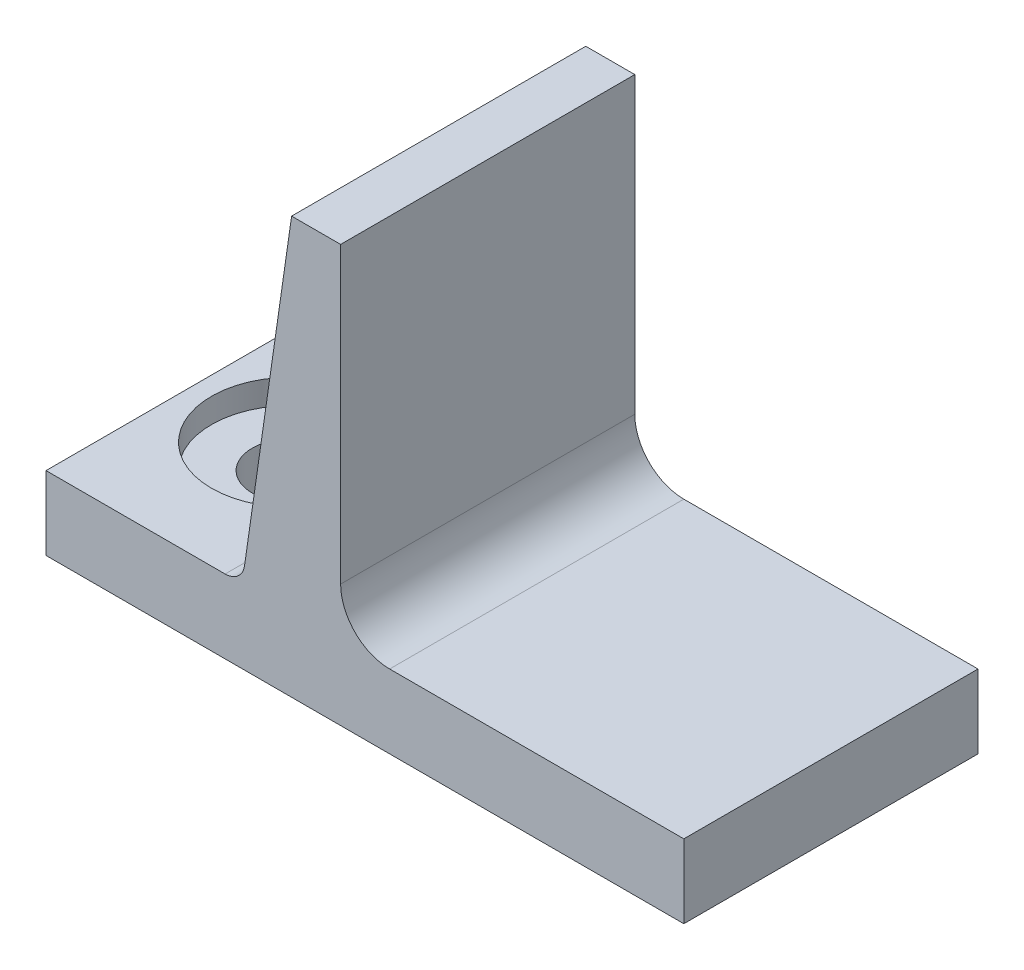
ISO-10303-21;
HEADER;
FILE_DESCRIPTION(('STEP AP214'),'2;1');
FILE_NAME('part.step','',(''),(''),'','','');
FILE_SCHEMA(('AUTOMOTIVE_DESIGN { 1 0 10303 214 1 1 1 1 }'));
ENDSEC;
DATA;
#1=APPLICATION_CONTEXT('core data for automotive mechanical design processes');
#2=APPLICATION_PROTOCOL_DEFINITION('international standard','automotive_design',2000,#1);
#3=PRODUCT_CONTEXT('',#1,'mechanical');
#4=PRODUCT('Part','Part','',(#3));
#5=PRODUCT_RELATED_PRODUCT_CATEGORY('part','',(#4));
#6=PRODUCT_DEFINITION_FORMATION('','',#4);
#7=PRODUCT_DEFINITION_CONTEXT('part definition',#1,'design');
#8=PRODUCT_DEFINITION('design','',#6,#7);
#9=PRODUCT_DEFINITION_SHAPE('','',#8);
#10=(LENGTH_UNIT() NAMED_UNIT(*) SI_UNIT(.MILLI.,.METRE.));
#11=(NAMED_UNIT(*) PLANE_ANGLE_UNIT() SI_UNIT($,.RADIAN.));
#12=(NAMED_UNIT(*) SI_UNIT($,.STERADIAN.) SOLID_ANGLE_UNIT());
#13=UNCERTAINTY_MEASURE_WITH_UNIT(LENGTH_MEASURE(1.E-05),#10,'distance_accuracy_value','');
#14=(GEOMETRIC_REPRESENTATION_CONTEXT(3) GLOBAL_UNCERTAINTY_ASSIGNED_CONTEXT((#13)) GLOBAL_UNIT_ASSIGNED_CONTEXT((#10,
#11,#12)) REPRESENTATION_CONTEXT('',''));
#15=CARTESIAN_POINT('',(0.,0.,0.));
#16=DIRECTION('',(0.,0.,1.));
#17=DIRECTION('',(1.,0.,0.));
#18=AXIS2_PLACEMENT_3D('',#15,#16,#17);
#19=CARTESIAN_POINT('',(0.,44.45,38.1));
#20=DIRECTION('',(-1.,0.,0.));
#21=DIRECTION('',(0.,-1.,0.));
#22=AXIS2_PLACEMENT_3D('',#19,#20,#21);
#23=PLANE('',#22);
#24=DIRECTION('',(0.,1.,0.));
#25=VECTOR('',#24,1.);
#26=CARTESIAN_POINT('',(0.,44.45,38.1));
#27=LINE('',#26,#25);
#28=CARTESIAN_POINT('',(0.,6.35000000000001,38.1));
#29=VERTEX_POINT('',#28);
#30=CARTESIAN_POINT('',(0.,44.45,38.1));
#31=VERTEX_POINT('',#30);
#32=EDGE_CURVE('E132',#29,#31,#27,.T.);
#33=ORIENTED_EDGE('',*,*,#32,.F.);
#34=DIRECTION('',(0.,0.,-1.));
#35=VECTOR('',#34,1.);
#36=CARTESIAN_POINT('',(0.,6.35000000000001,0.));
#37=LINE('',#36,#35);
#38=CARTESIAN_POINT('',(0.,6.35000000000001,0.));
#39=VERTEX_POINT('',#38);
#40=EDGE_CURVE('E171',#29,#39,#37,.T.);
#41=ORIENTED_EDGE('',*,*,#40,.T.);
#42=DIRECTION('',(0.,1.,0.));
#43=VECTOR('',#42,1.);
#44=CARTESIAN_POINT('',(0.,44.45,0.));
#45=LINE('',#44,#43);
#46=CARTESIAN_POINT('',(0.,44.45,0.));
#47=VERTEX_POINT('',#46);
#48=EDGE_CURVE('E155',#39,#47,#45,.T.);
#49=ORIENTED_EDGE('',*,*,#48,.T.);
#50=DIRECTION('',(0.,0.,-1.));
#51=VECTOR('',#50,1.);
#52=CARTESIAN_POINT('',(0.,44.45,38.1));
#53=LINE('',#52,#51);
#54=EDGE_CURVE('E149',#31,#47,#53,.T.);
#55=ORIENTED_EDGE('',*,*,#54,.F.);
#56=EDGE_LOOP('',(#33,#41,#49,#55));
#57=FACE_BOUND('',#56,.T.);
#58=ADVANCED_FACE('F56',(#57),#23,.F.);
#59=CARTESIAN_POINT('',(-6.35,44.45,38.1));
#60=DIRECTION('',(0.,-1.,0.));
#61=DIRECTION('',(0.,0.,-1.));
#62=AXIS2_PLACEMENT_3D('',#59,#60,#61);
#63=PLANE('',#62);
#64=DIRECTION('',(-1.,0.,0.));
#65=VECTOR('',#64,1.);
#66=CARTESIAN_POINT('',(-6.35,44.45,0.));
#67=LINE('',#66,#65);
#68=CARTESIAN_POINT('',(-6.35,44.45,0.));
#69=VERTEX_POINT('',#68);
#70=EDGE_CURVE('E215',#47,#69,#67,.T.);
#71=ORIENTED_EDGE('',*,*,#70,.T.);
#72=DIRECTION('',(0.,0.,-1.));
#73=VECTOR('',#72,1.);
#74=CARTESIAN_POINT('',(-6.35,44.45,38.1));
#75=LINE('',#74,#73);
#76=CARTESIAN_POINT('',(-6.35,44.45,38.1));
#77=VERTEX_POINT('',#76);
#78=EDGE_CURVE('E151',#77,#69,#75,.T.);
#79=ORIENTED_EDGE('',*,*,#78,.F.);
#80=DIRECTION('',(-1.,0.,0.));
#81=VECTOR('',#80,1.);
#82=CARTESIAN_POINT('',(-6.35,44.45,38.1));
#83=LINE('',#82,#81);
#84=EDGE_CURVE('E136',#31,#77,#83,.T.);
#85=ORIENTED_EDGE('',*,*,#84,.F.);
#86=ORIENTED_EDGE('',*,*,#54,.T.);
#87=EDGE_LOOP('',(#71,#79,#85,#86));
#88=FACE_BOUND('',#87,.T.);
#89=ADVANCED_FACE('F148',(#88),#63,.F.);
#90=CARTESIAN_POINT('',(-12.7608076,0.,38.1));
#91=DIRECTION('',(0.989759045724753,-0.142748139763802,0.));
#92=DIRECTION('',(0.142748139763802,0.989759045724753,0.));
#93=AXIS2_PLACEMENT_3D('',#90,#91,#92);
#94=PLANE('',#93);
#95=DIRECTION('',(-0.142748139763802,-0.989759045724753,0.));
#96=VECTOR('',#95,1.);
#97=CARTESIAN_POINT('',(-12.7608076,0.,0.));
#98=LINE('',#97,#96);
#99=CARTESIAN_POINT('',(-12.4467689291019,2.17741972499994,0.));
#100=VERTEX_POINT('',#99);
#101=EDGE_CURVE('E217',#69,#100,#98,.T.);
#102=ORIENTED_EDGE('',*,*,#101,.T.);
#103=DIRECTION('',(0.,0.,-1.));
#104=VECTOR('',#103,1.);
#105=CARTESIAN_POINT('',(-12.4467689291019,2.17741972499994,38.1));
#106=LINE('',#105,#104);
#107=CARTESIAN_POINT('',(-12.4467689291019,2.17741972499994,38.1));
#108=VERTEX_POINT('',#107);
#109=EDGE_CURVE('E160',#100,#108,#106,.F.);
#110=ORIENTED_EDGE('',*,*,#109,.T.);
#111=DIRECTION('',(-0.142748139763802,-0.989759045724753,0.));
#112=VECTOR('',#111,1.);
#113=CARTESIAN_POINT('',(-12.7608076,0.,38.1));
#114=LINE('',#113,#112);
#115=EDGE_CURVE('E153',#77,#108,#114,.T.);
#116=ORIENTED_EDGE('',*,*,#115,.F.);
#117=ORIENTED_EDGE('',*,*,#78,.T.);
#118=EDGE_LOOP('',(#102,#110,#116,#117));
#119=FACE_BOUND('',#118,.T.);
#120=ADVANCED_FACE('F264',(#119),#94,.F.);
#121=CARTESIAN_POINT('',(-38.1608076,0.,38.1));
#122=DIRECTION('',(0.,-1.,0.));
#123=DIRECTION('',(0.,0.,-1.));
#124=AXIS2_PLACEMENT_3D('',#121,#122,#123);
#125=PLANE('',#124);
#126=CARTESIAN_POINT('',(-25.4608076,0.,19.05));
#127=DIRECTION('',(0.,1.,0.));
#128=DIRECTION('',(0.,0.,1.));
#129=AXIS2_PLACEMENT_3D('',#126,#127,#128);
#130=CIRCLE('',#129,10.31875);
#131=CARTESIAN_POINT('',(-25.4608076,0.,29.36875));
#132=VERTEX_POINT('',#131);
#133=EDGE_CURVE('E177',#132,#132,#130,.T.);
#134=ORIENTED_EDGE('',*,*,#133,.F.);
#135=EDGE_LOOP('',(#134));
#136=FACE_BOUND('',#135,.T.);
#137=DIRECTION('',(-1.,0.,0.));
#138=VECTOR('',#137,1.);
#139=CARTESIAN_POINT('',(-38.1608076,0.,38.1));
#140=LINE('',#139,#138);
#141=CARTESIAN_POINT('',(-14.9607569052428,0.,38.1));
#142=VERTEX_POINT('',#141);
#143=CARTESIAN_POINT('',(-38.1608076,0.,38.1));
#144=VERTEX_POINT('',#143);
#145=EDGE_CURVE('E193',#142,#144,#140,.T.);
#146=ORIENTED_EDGE('',*,*,#145,.F.);
#147=DIRECTION('',(0.,0.,-1.));
#148=VECTOR('',#147,1.);
#149=CARTESIAN_POINT('',(-14.9607569052428,0.,0.));
#150=LINE('',#149,#148);
#151=CARTESIAN_POINT('',(-14.9607569052428,0.,0.));
#152=VERTEX_POINT('',#151);
#153=EDGE_CURVE('E157',#142,#152,#150,.T.);
#154=ORIENTED_EDGE('',*,*,#153,.T.);
#155=DIRECTION('',(-1.,0.,0.));
#156=VECTOR('',#155,1.);
#157=CARTESIAN_POINT('',(-38.1608076,0.,0.));
#158=LINE('',#157,#156);
#159=CARTESIAN_POINT('',(-38.1608076,0.,0.));
#160=VERTEX_POINT('',#159);
#161=EDGE_CURVE('E225',#152,#160,#158,.T.);
#162=ORIENTED_EDGE('',*,*,#161,.T.);
#163=DIRECTION('',(0.,0.,-1.));
#164=VECTOR('',#163,1.);
#165=CARTESIAN_POINT('',(-38.1608076,0.,38.1));
#166=LINE('',#165,#164);
#167=EDGE_CURVE('E162',#144,#160,#166,.T.);
#168=ORIENTED_EDGE('',*,*,#167,.F.);
#169=EDGE_LOOP('',(#146,#154,#162,#168));
#170=FACE_BOUND('',#169,.T.);
#171=ADVANCED_FACE('F258',(#136,#170),#125,.F.);
#172=CARTESIAN_POINT('',(-38.1608076,-9.52500000000001,38.1));
#173=DIRECTION('',(1.,0.,0.));
#174=DIRECTION('',(0.,1.,0.));
#175=AXIS2_PLACEMENT_3D('',#172,#173,#174);
#176=PLANE('',#175);
#177=DIRECTION('',(0.,-1.,0.));
#178=VECTOR('',#177,1.);
#179=CARTESIAN_POINT('',(-38.1608076,-9.52500000000001,0.));
#180=LINE('',#179,#178);
#181=CARTESIAN_POINT('',(-38.1608076,-9.52500000000001,0.));
#182=VERTEX_POINT('',#181);
#183=EDGE_CURVE('E227',#160,#182,#180,.T.);
#184=ORIENTED_EDGE('',*,*,#183,.T.);
#185=DIRECTION('',(0.,0.,-1.));
#186=VECTOR('',#185,1.);
#187=CARTESIAN_POINT('',(-38.1608076,-9.52500000000001,38.1));
#188=LINE('',#187,#186);
#189=CARTESIAN_POINT('',(-38.1608076,-9.52500000000001,38.1));
#190=VERTEX_POINT('',#189);
#191=EDGE_CURVE('E186',#190,#182,#188,.T.);
#192=ORIENTED_EDGE('',*,*,#191,.F.);
#193=DIRECTION('',(0.,-1.,0.));
#194=VECTOR('',#193,1.);
#195=CARTESIAN_POINT('',(-38.1608076,-9.52500000000001,38.1));
#196=LINE('',#195,#194);
#197=EDGE_CURVE('E194',#144,#190,#196,.T.);
#198=ORIENTED_EDGE('',*,*,#197,.F.);
#199=ORIENTED_EDGE('',*,*,#167,.T.);
#200=EDGE_LOOP('',(#184,#192,#198,#199));
#201=FACE_BOUND('',#200,.T.);
#202=ADVANCED_FACE('F256',(#201),#176,.F.);
#203=CARTESIAN_POINT('',(44.45,-9.525,38.1));
#204=DIRECTION('',(0.,1.,0.));
#205=DIRECTION('',(-1.,0.,0.));
#206=AXIS2_PLACEMENT_3D('',#203,#204,#205);
#207=PLANE('',#206);
#208=CARTESIAN_POINT('',(-25.4608076,-9.52500000000001,19.05));
#209=DIRECTION('',(0.,1.,0.));
#210=DIRECTION('',(0.,0.,1.));
#211=AXIS2_PLACEMENT_3D('',#208,#209,#210);
#212=CIRCLE('',#211,5.0419);
#213=CARTESIAN_POINT('',(-25.4608076,-9.52500000000001,24.0919));
#214=VERTEX_POINT('',#213);
#215=EDGE_CURVE('E183',#214,#214,#212,.T.);
#216=ORIENTED_EDGE('',*,*,#215,.T.);
#217=EDGE_LOOP('',(#216));
#218=FACE_BOUND('',#217,.T.);
#219=DIRECTION('',(1.,0.,0.));
#220=VECTOR('',#219,1.);
#221=CARTESIAN_POINT('',(44.45,-9.525,0.));
#222=LINE('',#221,#220);
#223=CARTESIAN_POINT('',(44.45,-9.525,0.));
#224=VERTEX_POINT('',#223);
#225=EDGE_CURVE('E229',#182,#224,#222,.T.);
#226=ORIENTED_EDGE('',*,*,#225,.T.);
#227=DIRECTION('',(0.,0.,-1.));
#228=VECTOR('',#227,1.);
#229=CARTESIAN_POINT('',(44.45,-9.525,38.1));
#230=LINE('',#229,#228);
#231=CARTESIAN_POINT('',(44.45,-9.525,38.1));
#232=VERTEX_POINT('',#231);
#233=EDGE_CURVE('E188',#232,#224,#230,.T.);
#234=ORIENTED_EDGE('',*,*,#233,.F.);
#235=DIRECTION('',(1.,0.,0.));
#236=VECTOR('',#235,1.);
#237=CARTESIAN_POINT('',(44.45,-9.525,38.1));
#238=LINE('',#237,#236);
#239=EDGE_CURVE('E198',#190,#232,#238,.T.);
#240=ORIENTED_EDGE('',*,*,#239,.F.);
#241=ORIENTED_EDGE('',*,*,#191,.T.);
#242=EDGE_LOOP('',(#226,#234,#240,#241));
#243=FACE_BOUND('',#242,.T.);
#244=ADVANCED_FACE('F242',(#218,#243),#207,.F.);
#245=CARTESIAN_POINT('',(44.45,0.,38.1));
#246=DIRECTION('',(-1.,0.,0.));
#247=DIRECTION('',(0.,-1.,0.));
#248=AXIS2_PLACEMENT_3D('',#245,#246,#247);
#249=PLANE('',#248);
#250=DIRECTION('',(0.,1.,0.));
#251=VECTOR('',#250,1.);
#252=CARTESIAN_POINT('',(44.45,0.,0.));
#253=LINE('',#252,#251);
#254=CARTESIAN_POINT('',(44.45,0.,0.));
#255=VERTEX_POINT('',#254);
#256=EDGE_CURVE('E231',#224,#255,#253,.T.);
#257=ORIENTED_EDGE('',*,*,#256,.T.);
#258=DIRECTION('',(0.,0.,-1.));
#259=VECTOR('',#258,1.);
#260=CARTESIAN_POINT('',(44.45,0.,38.1));
#261=LINE('',#260,#259);
#262=CARTESIAN_POINT('',(44.45,0.,38.1));
#263=VERTEX_POINT('',#262);
#264=EDGE_CURVE('E191',#263,#255,#261,.T.);
#265=ORIENTED_EDGE('',*,*,#264,.F.);
#266=DIRECTION('',(0.,1.,0.));
#267=VECTOR('',#266,1.);
#268=CARTESIAN_POINT('',(44.45,0.,38.1));
#269=LINE('',#268,#267);
#270=EDGE_CURVE('E255',#232,#263,#269,.T.);
#271=ORIENTED_EDGE('',*,*,#270,.F.);
#272=ORIENTED_EDGE('',*,*,#233,.T.);
#273=EDGE_LOOP('',(#257,#265,#271,#272));
#274=FACE_BOUND('',#273,.T.);
#275=ADVANCED_FACE('F252',(#274),#249,.F.);
#276=CARTESIAN_POINT('',(0.,0.,38.1));
#277=DIRECTION('',(0.,-1.,0.));
#278=DIRECTION('',(0.,0.,-1.));
#279=AXIS2_PLACEMENT_3D('',#276,#277,#278);
#280=PLANE('',#279);
#281=DIRECTION('',(-1.,0.,0.));
#282=VECTOR('',#281,1.);
#283=CARTESIAN_POINT('',(0.,0.,0.));
#284=LINE('',#283,#282);
#285=CARTESIAN_POINT('',(6.35,0.,0.));
#286=VERTEX_POINT('',#285);
#287=EDGE_CURVE('E144',#255,#286,#284,.T.);
#288=ORIENTED_EDGE('',*,*,#287,.T.);
#289=DIRECTION('',(0.,0.,-1.));
#290=VECTOR('',#289,1.);
#291=CARTESIAN_POINT('',(6.35,0.,38.1));
#292=LINE('',#291,#290);
#293=CARTESIAN_POINT('',(6.35,0.,38.1));
#294=VERTEX_POINT('',#293);
#295=EDGE_CURVE('E71',#286,#294,#292,.F.);
#296=ORIENTED_EDGE('',*,*,#295,.T.);
#297=DIRECTION('',(-1.,0.,0.));
#298=VECTOR('',#297,1.);
#299=CARTESIAN_POINT('',(0.,0.,38.1));
#300=LINE('',#299,#298);
#301=EDGE_CURVE('E220',#263,#294,#300,.T.);
#302=ORIENTED_EDGE('',*,*,#301,.F.);
#303=ORIENTED_EDGE('',*,*,#264,.T.);
#304=EDGE_LOOP('',(#288,#296,#302,#303));
#305=FACE_BOUND('',#304,.T.);
#306=ADVANCED_FACE('F254',(#305),#280,.F.);
#307=CARTESIAN_POINT('',(0.,0.,38.1));
#308=DIRECTION('',(0.,0.,1.));
#309=DIRECTION('',(1.,0.,0.));
#310=AXIS2_PLACEMENT_3D('',#307,#308,#309);
#311=PLANE('',#310);
#312=ORIENTED_EDGE('',*,*,#301,.T.);
#313=CARTESIAN_POINT('',(6.35,6.35000000000001,38.1));
#314=DIRECTION('',(0.,0.,1.));
#315=DIRECTION('',(1.,0.,0.));
#316=AXIS2_PLACEMENT_3D('',#313,#314,#315);
#317=CIRCLE('',#316,6.35);
#318=EDGE_CURVE('E12',#294,#29,#317,.F.);
#319=ORIENTED_EDGE('',*,*,#318,.T.);
#320=ORIENTED_EDGE('',*,*,#32,.T.);
#321=ORIENTED_EDGE('',*,*,#84,.T.);
#322=ORIENTED_EDGE('',*,*,#115,.T.);
#323=CARTESIAN_POINT('',(-14.9607569052428,2.54,38.1));
#324=DIRECTION('',(0.,0.,1.));
#325=DIRECTION('',(1.,0.,0.));
#326=AXIS2_PLACEMENT_3D('',#323,#324,#325);
#327=CIRCLE('',#326,2.54);
#328=EDGE_CURVE('E169',#108,#142,#327,.F.);
#329=ORIENTED_EDGE('',*,*,#328,.T.);
#330=ORIENTED_EDGE('',*,*,#145,.T.);
#331=ORIENTED_EDGE('',*,*,#197,.T.);
#332=ORIENTED_EDGE('',*,*,#239,.T.);
#333=ORIENTED_EDGE('',*,*,#270,.T.);
#334=EDGE_LOOP('',(#312,#319,#320,#321,#322,#329,#330,#331,#332,#333));
#335=FACE_BOUND('',#334,.T.);
#336=ADVANCED_FACE('F134',(#335),#311,.T.);
#337=CARTESIAN_POINT('',(0.,0.,0.));
#338=DIRECTION('',(0.,0.,1.));
#339=DIRECTION('',(1.,0.,0.));
#340=AXIS2_PLACEMENT_3D('',#337,#338,#339);
#341=PLANE('',#340);
#342=ORIENTED_EDGE('',*,*,#48,.F.);
#343=CARTESIAN_POINT('',(6.35,6.35000000000001,0.));
#344=DIRECTION('',(0.,0.,1.));
#345=DIRECTION('',(1.,0.,0.));
#346=AXIS2_PLACEMENT_3D('',#343,#344,#345);
#347=CIRCLE('',#346,6.35);
#348=EDGE_CURVE('E64',#39,#286,#347,.T.);
#349=ORIENTED_EDGE('',*,*,#348,.T.);
#350=ORIENTED_EDGE('',*,*,#287,.F.);
#351=ORIENTED_EDGE('',*,*,#256,.F.);
#352=ORIENTED_EDGE('',*,*,#225,.F.);
#353=ORIENTED_EDGE('',*,*,#183,.F.);
#354=ORIENTED_EDGE('',*,*,#161,.F.);
#355=CARTESIAN_POINT('',(-14.9607569052428,2.54,0.));
#356=DIRECTION('',(0.,0.,1.));
#357=DIRECTION('',(1.,0.,0.));
#358=AXIS2_PLACEMENT_3D('',#355,#356,#357);
#359=CIRCLE('',#358,2.54);
#360=EDGE_CURVE('E167',#152,#100,#359,.T.);
#361=ORIENTED_EDGE('',*,*,#360,.T.);
#362=ORIENTED_EDGE('',*,*,#101,.F.);
#363=ORIENTED_EDGE('',*,*,#70,.F.);
#364=EDGE_LOOP('',(#342,#349,#350,#351,#352,#353,#354,#361,#362,#363));
#365=FACE_BOUND('',#364,.T.);
#366=ADVANCED_FACE('F248',(#365),#341,.F.);
#367=CARTESIAN_POINT('',(-25.4608076,0.,19.05));
#368=DIRECTION('',(0.,1.,0.));
#369=DIRECTION('',(0.,0.,1.));
#370=AXIS2_PLACEMENT_3D('',#367,#368,#369);
#371=CYLINDRICAL_SURFACE('',#370,5.0419);
#372=ORIENTED_EDGE('',*,*,#215,.F.);
#373=EDGE_LOOP('',(#372));
#374=FACE_BOUND('',#373,.T.);
#375=CARTESIAN_POINT('',(-25.4608076,-3.175,19.05));
#376=DIRECTION('',(0.,1.,0.));
#377=DIRECTION('',(0.,0.,1.));
#378=AXIS2_PLACEMENT_3D('',#375,#376,#377);
#379=CIRCLE('',#378,5.0419);
#380=CARTESIAN_POINT('',(-25.4608076,-3.175,24.0919));
#381=VERTEX_POINT('',#380);
#382=EDGE_CURVE('E180',#381,#381,#379,.T.);
#383=ORIENTED_EDGE('',*,*,#382,.T.);
#384=EDGE_LOOP('',(#383));
#385=FACE_BOUND('',#384,.T.);
#386=ADVANCED_FACE('F300',(#374,#385),#371,.F.);
#387=CARTESIAN_POINT('',(-15.1420576,-3.175,19.05));
#388=DIRECTION('',(0.,-1.,0.));
#389=DIRECTION('',(0.,0.,-1.));
#390=AXIS2_PLACEMENT_3D('',#387,#388,#389);
#391=PLANE('',#390);
#392=ORIENTED_EDGE('',*,*,#382,.F.);
#393=EDGE_LOOP('',(#392));
#394=FACE_BOUND('',#393,.T.);
#395=CARTESIAN_POINT('',(-25.4608076,-3.175,19.05));
#396=DIRECTION('',(0.,1.,0.));
#397=DIRECTION('',(0.,0.,1.));
#398=AXIS2_PLACEMENT_3D('',#395,#396,#397);
#399=CIRCLE('',#398,10.31875);
#400=CARTESIAN_POINT('',(-25.4608076,-3.175,29.36875));
#401=VERTEX_POINT('',#400);
#402=EDGE_CURVE('E176',#401,#401,#399,.T.);
#403=ORIENTED_EDGE('',*,*,#402,.T.);
#404=EDGE_LOOP('',(#403));
#405=FACE_BOUND('',#404,.T.);
#406=ADVANCED_FACE('F276',(#394,#405),#391,.F.);
#407=CARTESIAN_POINT('',(-25.4608076,0.,19.05));
#408=DIRECTION('',(0.,1.,0.));
#409=DIRECTION('',(0.,0.,1.));
#410=AXIS2_PLACEMENT_3D('',#407,#408,#409);
#411=CYLINDRICAL_SURFACE('',#410,10.31875);
#412=ORIENTED_EDGE('',*,*,#402,.F.);
#413=EDGE_LOOP('',(#412));
#414=FACE_BOUND('',#413,.T.);
#415=ORIENTED_EDGE('',*,*,#133,.T.);
#416=EDGE_LOOP('',(#415));
#417=FACE_BOUND('',#416,.T.);
#418=ADVANCED_FACE('F268',(#414,#417),#411,.F.);
#419=CARTESIAN_POINT('',(-14.9607569052428,2.54,38.1));
#420=DIRECTION('',(0.,0.,1.));
#421=DIRECTION('',(1.,0.,0.));
#422=AXIS2_PLACEMENT_3D('',#419,#420,#421);
#423=CYLINDRICAL_SURFACE('',#422,2.54);
#424=ORIENTED_EDGE('',*,*,#328,.F.);
#425=ORIENTED_EDGE('',*,*,#109,.F.);
#426=ORIENTED_EDGE('',*,*,#360,.F.);
#427=ORIENTED_EDGE('',*,*,#153,.F.);
#428=EDGE_LOOP('',(#424,#425,#426,#427));
#429=FACE_BOUND('',#428,.T.);
#430=ADVANCED_FACE('F266',(#429),#423,.F.);
#431=CARTESIAN_POINT('',(6.35,6.35000000000001,38.1));
#432=DIRECTION('',(0.,0.,1.));
#433=DIRECTION('',(1.,0.,0.));
#434=AXIS2_PLACEMENT_3D('',#431,#432,#433);
#435=CYLINDRICAL_SURFACE('',#434,6.35);
#436=ORIENTED_EDGE('',*,*,#318,.F.);
#437=ORIENTED_EDGE('',*,*,#295,.F.);
#438=ORIENTED_EDGE('',*,*,#348,.F.);
#439=ORIENTED_EDGE('',*,*,#40,.F.);
#440=EDGE_LOOP('',(#436,#437,#438,#439));
#441=FACE_BOUND('',#440,.T.);
#442=ADVANCED_FACE('F58',(#441),#435,.F.);
#443=CLOSED_SHELL('',(#58,#89,#120,#171,#202,#244,#275,#306,#336,#366,#386,#406,#418,#430,#442));
#444=MANIFOLD_SOLID_BREP('B2',#443);
#445=ADVANCED_BREP_SHAPE_REPRESENTATION('',(#18,#444),#14);
#446=SHAPE_DEFINITION_REPRESENTATION(#9,#445);
ENDSEC;
END-ISO-10303-21;
